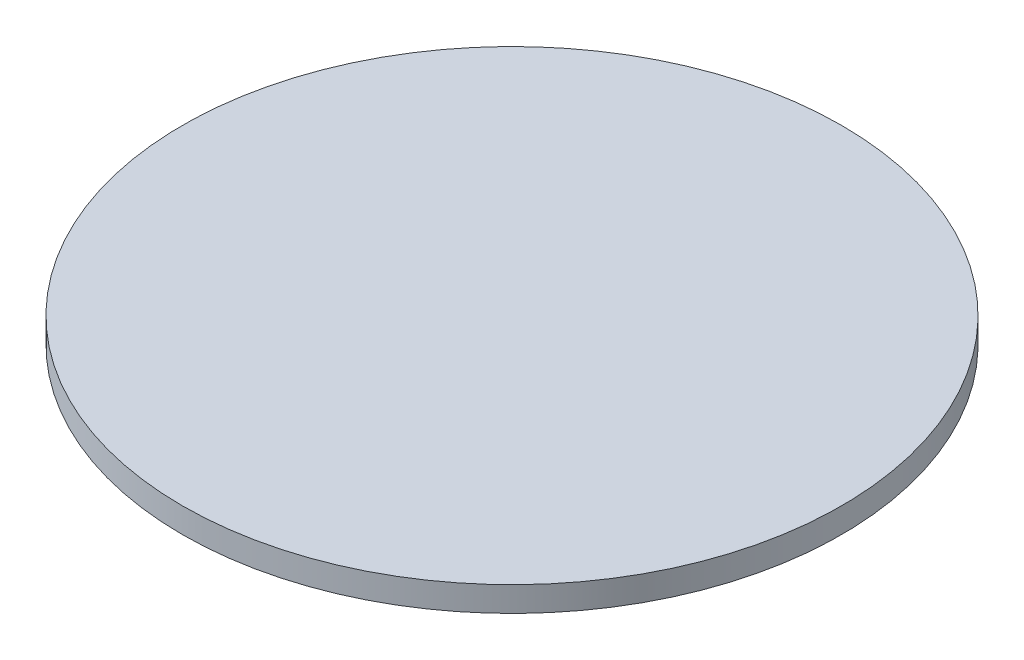
ISO-10303-21;
HEADER;
FILE_DESCRIPTION(('STEP AP214'),'2;1');
FILE_NAME('part.step','',(''),(''),'','','');
FILE_SCHEMA(('AUTOMOTIVE_DESIGN { 1 0 10303 214 1 1 1 1 }'));
ENDSEC;
DATA;
#1=APPLICATION_CONTEXT('core data for automotive mechanical design processes');
#2=APPLICATION_PROTOCOL_DEFINITION('international standard','automotive_design',2000,#1);
#3=PRODUCT_CONTEXT('',#1,'mechanical');
#4=PRODUCT('Part','Part','',(#3));
#5=PRODUCT_RELATED_PRODUCT_CATEGORY('part','',(#4));
#6=PRODUCT_DEFINITION_FORMATION('','',#4);
#7=PRODUCT_DEFINITION_CONTEXT('part definition',#1,'design');
#8=PRODUCT_DEFINITION('design','',#6,#7);
#9=PRODUCT_DEFINITION_SHAPE('','',#8);
#10=(LENGTH_UNIT() NAMED_UNIT(*) SI_UNIT(.MILLI.,.METRE.));
#11=(NAMED_UNIT(*) PLANE_ANGLE_UNIT() SI_UNIT($,.RADIAN.));
#12=(NAMED_UNIT(*) SI_UNIT($,.STERADIAN.) SOLID_ANGLE_UNIT());
#13=UNCERTAINTY_MEASURE_WITH_UNIT(LENGTH_MEASURE(1.E-05),#10,'distance_accuracy_value','');
#14=(GEOMETRIC_REPRESENTATION_CONTEXT(3) GLOBAL_UNCERTAINTY_ASSIGNED_CONTEXT((#13)) GLOBAL_UNIT_ASSIGNED_CONTEXT((#10,
#11,#12)) REPRESENTATION_CONTEXT('',''));
#15=CARTESIAN_POINT('',(0.,0.,0.));
#16=DIRECTION('',(0.,0.,1.));
#17=DIRECTION('',(1.,0.,0.));
#18=AXIS2_PLACEMENT_3D('',#15,#16,#17);
#19=CARTESIAN_POINT('',(0.,0.79375,0.));
#20=DIRECTION('',(0.,-1.,0.));
#21=DIRECTION('',(0.,0.,-1.));
#22=AXIS2_PLACEMENT_3D('',#19,#20,#21);
#23=CYLINDRICAL_SURFACE('',#22,220.29375);
#24=CARTESIAN_POINT('',(0.,-13.4658722101948,0.));
#25=DIRECTION('',(0.,-1.,0.));
#26=DIRECTION('',(0.,0.,-1.));
#27=AXIS2_PLACEMENT_3D('',#24,#25,#26);
#28=CIRCLE('',#27,220.29375);
#29=CARTESIAN_POINT('',(-220.262941421733,-13.4658722101948,3.68414512592614));
#30=VERTEX_POINT('',#29);
#31=CARTESIAN_POINT('',(-219.484918456649,-13.4658722101948,18.8601924470733));
#32=VERTEX_POINT('',#31);
#33=EDGE_CURVE('E161',#30,#32,#28,.F.);
#34=ORIENTED_EDGE('',*,*,#33,.F.);
#35=CARTESIAN_POINT('',(0.,-13.4658722101948,0.));
#36=DIRECTION('',(0.,-1.,0.));
#37=DIRECTION('',(0.,0.,-1.));
#38=AXIS2_PLACEMENT_3D('',#35,#36,#37);
#39=CIRCLE('',#38,220.29375);
#40=CARTESIAN_POINT('',(-220.128586465602,-13.4658722101948,-8.52887505585829));
#41=VERTEX_POINT('',#40);
#42=EDGE_CURVE('E63',#41,#30,#39,.F.);
#43=ORIENTED_EDGE('',*,*,#42,.F.);
#44=DIRECTION('',(0.,-1.,0.));
#45=VECTOR('',#44,1.);
#46=CARTESIAN_POINT('',(-220.128586465602,0.79375,-8.52887505585829));
#47=LINE('',#46,#45);
#48=CARTESIAN_POINT('',(-220.128586465602,0.,-8.52887505585829));
#49=VERTEX_POINT('',#48);
#50=EDGE_CURVE('E58',#49,#41,#47,.T.);
#51=ORIENTED_EDGE('',*,*,#50,.F.);
#52=CARTESIAN_POINT('',(0.,0.,0.));
#53=DIRECTION('',(0.,1.,0.));
#54=DIRECTION('',(0.,0.,1.));
#55=AXIS2_PLACEMENT_3D('',#52,#53,#54);
#56=CIRCLE('',#55,220.29375);
#57=CARTESIAN_POINT('',(-220.262941421733,0.,3.68414512592614));
#58=VERTEX_POINT('',#57);
#59=EDGE_CURVE('E157',#58,#49,#56,.F.);
#60=ORIENTED_EDGE('',*,*,#59,.F.);
#61=CARTESIAN_POINT('',(0.,0.,0.));
#62=DIRECTION('',(0.,1.,0.));
#63=DIRECTION('',(0.,0.,1.));
#64=AXIS2_PLACEMENT_3D('',#61,#62,#63);
#65=CIRCLE('',#64,220.29375);
#66=CARTESIAN_POINT('',(-219.484918456649,0.,18.8601924470733));
#67=VERTEX_POINT('',#66);
#68=EDGE_CURVE('E167',#67,#58,#65,.F.);
#69=ORIENTED_EDGE('',*,*,#68,.F.);
#70=DIRECTION('',(0.,-1.,0.));
#71=VECTOR('',#70,1.);
#72=CARTESIAN_POINT('',(-219.484918456649,0.79375,18.8601924470733));
#73=LINE('',#72,#71);
#74=EDGE_CURVE('E164',#32,#67,#73,.F.);
#75=ORIENTED_EDGE('',*,*,#74,.F.);
#76=EDGE_LOOP('',(#34,#43,#51,#60,#69,#75));
#77=FACE_BOUND('',#76,.T.);
#78=CARTESIAN_POINT('',(0.,-15.875,0.));
#79=DIRECTION('',(0.,-1.,0.));
#80=DIRECTION('',(0.,0.,-1.));
#81=AXIS2_PLACEMENT_3D('',#78,#79,#80);
#82=CIRCLE('',#81,220.29375);
#83=CARTESIAN_POINT('',(0.,-15.875,-220.29375));
#84=VERTEX_POINT('',#83);
#85=EDGE_CURVE('E51',#84,#84,#82,.T.);
#86=ORIENTED_EDGE('',*,*,#85,.F.);
#87=EDGE_LOOP('',(#86));
#88=FACE_BOUND('',#87,.T.);
#89=CARTESIAN_POINT('',(0.,0.79375,0.));
#90=DIRECTION('',(0.,1.,0.));
#91=DIRECTION('',(0.,0.,1.));
#92=AXIS2_PLACEMENT_3D('',#89,#90,#91);
#93=CIRCLE('',#92,220.29375);
#94=CARTESIAN_POINT('',(0.,0.79375,220.29375));
#95=VERTEX_POINT('',#94);
#96=EDGE_CURVE('E13',#95,#95,#93,.T.);
#97=ORIENTED_EDGE('',*,*,#96,.F.);
#98=EDGE_LOOP('',(#97));
#99=FACE_BOUND('',#98,.T.);
#100=ADVANCED_FACE('F44',(#77,#88,#99),#23,.T.);
#101=CARTESIAN_POINT('',(0.,0.,0.));
#102=DIRECTION('',(0.,1.,0.));
#103=DIRECTION('',(0.,0.,1.));
#104=AXIS2_PLACEMENT_3D('',#101,#102,#103);
#105=PLANE('',#104);
#106=CARTESIAN_POINT('',(0.,0.,0.));
#107=DIRECTION('',(0.,-1.,0.));
#108=DIRECTION('',(0.,0.,-1.));
#109=AXIS2_PLACEMENT_3D('',#106,#107,#108);
#110=CIRCLE('',#109,219.5);
#111=CARTESIAN_POINT('',(-219.132288812032,0.,-12.7));
#112=VERTEX_POINT('',#111);
#113=CARTESIAN_POINT('',(219.132288812032,0.,-12.7));
#114=VERTEX_POINT('',#113);
#115=EDGE_CURVE('E215',#112,#114,#110,.T.);
#116=ORIENTED_EDGE('',*,*,#115,.T.);
#117=DIRECTION('',(1.,0.,0.));
#118=VECTOR('',#117,1.);
#119=CARTESIAN_POINT('',(-220.29575,0.,-12.7));
#120=LINE('',#119,#118);
#121=EDGE_CURVE('E218',#112,#114,#120,.T.);
#122=ORIENTED_EDGE('',*,*,#121,.F.);
#123=EDGE_LOOP('',(#116,#122));
#124=FACE_BOUND('',#123,.T.);
#125=ADVANCED_FACE('F250',(#124),#105,.F.);
#126=CARTESIAN_POINT('',(0.,0.79375,0.));
#127=DIRECTION('',(0.,1.,0.));
#128=DIRECTION('',(0.,0.,1.));
#129=AXIS2_PLACEMENT_3D('',#126,#127,#128);
#130=PLANE('',#129);
#131=ORIENTED_EDGE('',*,*,#96,.T.);
#132=EDGE_LOOP('',(#131));
#133=FACE_BOUND('',#132,.T.);
#134=ADVANCED_FACE('F253',(#133),#130,.T.);
#135=CARTESIAN_POINT('',(0.,-15.875,0.));
#136=DIRECTION('',(0.,-1.,0.));
#137=DIRECTION('',(0.,0.,-1.));
#138=AXIS2_PLACEMENT_3D('',#135,#136,#137);
#139=PLANE('',#138);
#140=ORIENTED_EDGE('',*,*,#85,.T.);
#141=EDGE_LOOP('',(#140));
#142=FACE_BOUND('',#141,.T.);
#143=CARTESIAN_POINT('',(0.,-15.875,0.));
#144=DIRECTION('',(0.,-1.,0.));
#145=DIRECTION('',(0.,0.,-1.));
#146=AXIS2_PLACEMENT_3D('',#143,#144,#145);
#147=CIRCLE('',#146,219.5);
#148=CARTESIAN_POINT('',(0.,-15.875,-219.5));
#149=VERTEX_POINT('',#148);
#150=EDGE_CURVE('E237',#149,#149,#147,.T.);
#151=ORIENTED_EDGE('',*,*,#150,.F.);
#152=EDGE_LOOP('',(#151));
#153=FACE_BOUND('',#152,.T.);
#154=ADVANCED_FACE('F245',(#142,#153),#139,.T.);
#155=CARTESIAN_POINT('',(0.,-15.875,0.));
#156=DIRECTION('',(0.,1.,0.));
#157=DIRECTION('',(0.,0.,1.));
#158=AXIS2_PLACEMENT_3D('',#155,#156,#157);
#159=CYLINDRICAL_SURFACE('',#158,219.5);
#160=DIRECTION('',(0.,1.,0.));
#161=VECTOR('',#160,1.);
#162=CARTESIAN_POINT('',(219.132288812032,-15.875,-12.7));
#163=LINE('',#162,#161);
#164=CARTESIAN_POINT('',(219.132288812032,-2.38124999999996,-12.7));
#165=VERTEX_POINT('',#164);
#166=EDGE_CURVE('E196',#114,#165,#163,.F.);
#167=ORIENTED_EDGE('',*,*,#166,.F.);
#168=ORIENTED_EDGE('',*,*,#115,.F.);
#169=DIRECTION('',(0.,1.,0.));
#170=VECTOR('',#169,1.);
#171=CARTESIAN_POINT('',(-219.132288812032,-15.875,-12.7));
#172=LINE('',#171,#170);
#173=CARTESIAN_POINT('',(-219.132288812032,-2.38124999999996,-12.7));
#174=VERTEX_POINT('',#173);
#175=EDGE_CURVE('E220',#112,#174,#172,.F.);
#176=ORIENTED_EDGE('',*,*,#175,.T.);
#177=CARTESIAN_POINT('',(0.,-2.38124999999996,0.));
#178=DIRECTION('',(0.,-1.,0.));
#179=DIRECTION('',(0.,0.,-1.));
#180=AXIS2_PLACEMENT_3D('',#177,#178,#179);
#181=CIRCLE('',#180,219.5);
#182=CARTESIAN_POINT('',(-219.4942592501,-2.38124999999996,-1.5875));
#183=VERTEX_POINT('',#182);
#184=EDGE_CURVE('E212',#174,#183,#181,.F.);
#185=ORIENTED_EDGE('',*,*,#184,.T.);
#186=DIRECTION('',(0.,1.,0.));
#187=VECTOR('',#186,1.);
#188=CARTESIAN_POINT('',(-219.4942592501,-15.875,-1.5875));
#189=LINE('',#188,#187);
#190=CARTESIAN_POINT('',(-219.4942592501,-11.90625,-1.5875));
#191=VERTEX_POINT('',#190);
#192=EDGE_CURVE('E216',#183,#191,#189,.F.);
#193=ORIENTED_EDGE('',*,*,#192,.T.);
#194=CARTESIAN_POINT('',(0.,-11.90625,0.));
#195=DIRECTION('',(0.,-1.,0.));
#196=DIRECTION('',(0.,0.,-1.));
#197=AXIS2_PLACEMENT_3D('',#194,#195,#196);
#198=CIRCLE('',#197,219.5);
#199=CARTESIAN_POINT('',(-219.4942592501,-11.90625,1.5875));
#200=VERTEX_POINT('',#199);
#201=EDGE_CURVE('E223',#191,#200,#198,.F.);
#202=ORIENTED_EDGE('',*,*,#201,.T.);
#203=DIRECTION('',(0.,1.,0.));
#204=VECTOR('',#203,1.);
#205=CARTESIAN_POINT('',(-219.4942592501,-15.875,1.5875));
#206=LINE('',#205,#204);
#207=CARTESIAN_POINT('',(-219.4942592501,-2.38124999999996,1.5875));
#208=VERTEX_POINT('',#207);
#209=EDGE_CURVE('E226',#200,#208,#206,.T.);
#210=ORIENTED_EDGE('',*,*,#209,.T.);
#211=CARTESIAN_POINT('',(0.,-2.38124999999996,0.));
#212=DIRECTION('',(0.,-1.,0.));
#213=DIRECTION('',(0.,0.,-1.));
#214=AXIS2_PLACEMENT_3D('',#211,#212,#213);
#215=CIRCLE('',#214,219.5);
#216=CARTESIAN_POINT('',(-219.132288812032,-2.38124999999996,12.7));
#217=VERTEX_POINT('',#216);
#218=EDGE_CURVE('E229',#208,#217,#215,.F.);
#219=ORIENTED_EDGE('',*,*,#218,.T.);
#220=DIRECTION('',(0.,1.,0.));
#221=VECTOR('',#220,1.);
#222=CARTESIAN_POINT('',(-219.132288812032,-15.875,12.7));
#223=LINE('',#222,#221);
#224=CARTESIAN_POINT('',(-219.132288812032,0.,12.7));
#225=VERTEX_POINT('',#224);
#226=EDGE_CURVE('E232',#217,#225,#223,.T.);
#227=ORIENTED_EDGE('',*,*,#226,.T.);
#228=CARTESIAN_POINT('',(219.132288812032,0.,12.7));
#229=VERTEX_POINT('',#228);
#230=EDGE_CURVE('E240',#229,#225,#110,.T.);
#231=ORIENTED_EDGE('',*,*,#230,.F.);
#232=DIRECTION('',(0.,1.,0.));
#233=VECTOR('',#232,1.);
#234=CARTESIAN_POINT('',(219.132288812032,-15.875,12.7));
#235=LINE('',#234,#233);
#236=CARTESIAN_POINT('',(219.132288812032,-2.38124999999996,12.7));
#237=VERTEX_POINT('',#236);
#238=EDGE_CURVE('E194',#237,#229,#235,.T.);
#239=ORIENTED_EDGE('',*,*,#238,.F.);
#240=CARTESIAN_POINT('',(0.,-2.38124999999996,0.));
#241=DIRECTION('',(0.,1.,0.));
#242=DIRECTION('',(0.,0.,1.));
#243=AXIS2_PLACEMENT_3D('',#240,#241,#242);
#244=CIRCLE('',#243,219.5);
#245=CARTESIAN_POINT('',(219.4942592501,-2.38124999999996,1.5875));
#246=VERTEX_POINT('',#245);
#247=EDGE_CURVE('E191',#246,#237,#244,.F.);
#248=ORIENTED_EDGE('',*,*,#247,.F.);
#249=DIRECTION('',(0.,1.,0.));
#250=VECTOR('',#249,1.);
#251=CARTESIAN_POINT('',(219.4942592501,-15.875,1.5875));
#252=LINE('',#251,#250);
#253=CARTESIAN_POINT('',(219.4942592501,-11.90625,1.5875));
#254=VERTEX_POINT('',#253);
#255=EDGE_CURVE('E188',#254,#246,#252,.T.);
#256=ORIENTED_EDGE('',*,*,#255,.F.);
#257=CARTESIAN_POINT('',(0.,-11.90625,0.));
#258=DIRECTION('',(0.,1.,0.));
#259=DIRECTION('',(0.,0.,1.));
#260=AXIS2_PLACEMENT_3D('',#257,#258,#259);
#261=CIRCLE('',#260,219.5);
#262=CARTESIAN_POINT('',(219.4942592501,-11.90625,-1.5875));
#263=VERTEX_POINT('',#262);
#264=EDGE_CURVE('E185',#263,#254,#261,.F.);
#265=ORIENTED_EDGE('',*,*,#264,.F.);
#266=DIRECTION('',(0.,1.,0.));
#267=VECTOR('',#266,1.);
#268=CARTESIAN_POINT('',(219.4942592501,-15.875,-1.5875));
#269=LINE('',#268,#267);
#270=CARTESIAN_POINT('',(219.4942592501,-2.38124999999996,-1.5875));
#271=VERTEX_POINT('',#270);
#272=EDGE_CURVE('E182',#271,#263,#269,.F.);
#273=ORIENTED_EDGE('',*,*,#272,.F.);
#274=CARTESIAN_POINT('',(0.,-2.38124999999996,0.));
#275=DIRECTION('',(0.,1.,0.));
#276=DIRECTION('',(0.,0.,1.));
#277=AXIS2_PLACEMENT_3D('',#274,#275,#276);
#278=CIRCLE('',#277,219.5);
#279=EDGE_CURVE('E170',#165,#271,#278,.F.);
#280=ORIENTED_EDGE('',*,*,#279,.F.);
#281=EDGE_LOOP('',(#167,#168,#176,#185,#193,#202,#210,#219,#227,#231,#239,#248,#256,#265,#273,#280));
#282=FACE_BOUND('',#281,.T.);
#283=ORIENTED_EDGE('',*,*,#150,.T.);
#284=EDGE_LOOP('',(#283));
#285=FACE_BOUND('',#284,.T.);
#286=ADVANCED_FACE('F260',(#282,#285),#159,.F.);
#287=ORIENTED_EDGE('',*,*,#230,.T.);
#288=DIRECTION('',(-1.,0.,0.));
#289=VECTOR('',#288,1.);
#290=CARTESIAN_POINT('',(-220.29575,0.,12.7));
#291=LINE('',#290,#289);
#292=EDGE_CURVE('E211',#229,#225,#291,.T.);
#293=ORIENTED_EDGE('',*,*,#292,.F.);
#294=EDGE_LOOP('',(#287,#293));
#295=FACE_BOUND('',#294,.T.);
#296=ADVANCED_FACE('F263',(#295),#105,.F.);
#297=CARTESIAN_POINT('',(-220.29575,0.793750000000043,-12.7));
#298=DIRECTION('',(0.,0.,-1.));
#299=DIRECTION('',(-1.,0.,0.));
#300=AXIS2_PLACEMENT_3D('',#297,#298,#299);
#301=PLANE('',#300);
#302=ORIENTED_EDGE('',*,*,#175,.F.);
#303=ORIENTED_EDGE('',*,*,#121,.T.);
#304=ORIENTED_EDGE('',*,*,#166,.T.);
#305=DIRECTION('',(1.,0.,0.));
#306=VECTOR('',#305,1.);
#307=CARTESIAN_POINT('',(-220.29575,-2.38124999999996,-12.7));
#308=LINE('',#307,#306);
#309=EDGE_CURVE('E199',#174,#165,#308,.T.);
#310=ORIENTED_EDGE('',*,*,#309,.F.);
#311=EDGE_LOOP('',(#302,#303,#304,#310));
#312=FACE_BOUND('',#311,.T.);
#313=ADVANCED_FACE('F266',(#312),#301,.T.);
#314=CARTESIAN_POINT('',(-220.29575,-2.38124999999996,-12.7));
#315=DIRECTION('',(0.,-1.,0.));
#316=DIRECTION('',(0.,0.,-1.));
#317=AXIS2_PLACEMENT_3D('',#314,#315,#316);
#318=PLANE('',#317);
#319=ORIENTED_EDGE('',*,*,#184,.F.);
#320=ORIENTED_EDGE('',*,*,#309,.T.);
#321=ORIENTED_EDGE('',*,*,#279,.T.);
#322=DIRECTION('',(1.,0.,0.));
#323=VECTOR('',#322,1.);
#324=CARTESIAN_POINT('',(-220.29575,-2.38124999999996,-1.5875));
#325=LINE('',#324,#323);
#326=EDGE_CURVE('E201',#183,#271,#325,.T.);
#327=ORIENTED_EDGE('',*,*,#326,.F.);
#328=EDGE_LOOP('',(#319,#320,#321,#327));
#329=FACE_BOUND('',#328,.T.);
#330=ADVANCED_FACE('F273',(#329),#318,.T.);
#331=CARTESIAN_POINT('',(-220.29575,-2.38124999999996,-1.5875));
#332=DIRECTION('',(0.,0.,-1.));
#333=DIRECTION('',(0.,1.,0.));
#334=AXIS2_PLACEMENT_3D('',#331,#332,#333);
#335=PLANE('',#334);
#336=ORIENTED_EDGE('',*,*,#192,.F.);
#337=ORIENTED_EDGE('',*,*,#326,.T.);
#338=ORIENTED_EDGE('',*,*,#272,.T.);
#339=DIRECTION('',(1.,0.,0.));
#340=VECTOR('',#339,1.);
#341=CARTESIAN_POINT('',(-220.29575,-11.90625,-1.5875));
#342=LINE('',#341,#340);
#343=EDGE_CURVE('E203',#191,#263,#342,.T.);
#344=ORIENTED_EDGE('',*,*,#343,.F.);
#345=EDGE_LOOP('',(#336,#337,#338,#344));
#346=FACE_BOUND('',#345,.T.);
#347=ADVANCED_FACE('F300',(#346),#335,.T.);
#348=CARTESIAN_POINT('',(-220.29575,-11.90625,-1.5875));
#349=DIRECTION('',(0.,-1.,0.));
#350=DIRECTION('',(0.,0.,-1.));
#351=AXIS2_PLACEMENT_3D('',#348,#349,#350);
#352=PLANE('',#351);
#353=ORIENTED_EDGE('',*,*,#201,.F.);
#354=ORIENTED_EDGE('',*,*,#343,.T.);
#355=ORIENTED_EDGE('',*,*,#264,.T.);
#356=DIRECTION('',(1.,0.,0.));
#357=VECTOR('',#356,1.);
#358=CARTESIAN_POINT('',(-220.29575,-11.90625,1.5875));
#359=LINE('',#358,#357);
#360=EDGE_CURVE('E205',#200,#254,#359,.T.);
#361=ORIENTED_EDGE('',*,*,#360,.F.);
#362=EDGE_LOOP('',(#353,#354,#355,#361));
#363=FACE_BOUND('',#362,.T.);
#364=ADVANCED_FACE('F296',(#363),#352,.T.);
#365=CARTESIAN_POINT('',(-220.29575,-2.38124999999996,1.5875));
#366=DIRECTION('',(0.,0.,1.));
#367=DIRECTION('',(0.,-1.,0.));
#368=AXIS2_PLACEMENT_3D('',#365,#366,#367);
#369=PLANE('',#368);
#370=ORIENTED_EDGE('',*,*,#209,.F.);
#371=ORIENTED_EDGE('',*,*,#360,.T.);
#372=ORIENTED_EDGE('',*,*,#255,.T.);
#373=DIRECTION('',(1.,0.,0.));
#374=VECTOR('',#373,1.);
#375=CARTESIAN_POINT('',(-220.29575,-2.38124999999996,1.5875));
#376=LINE('',#375,#374);
#377=EDGE_CURVE('E207',#208,#246,#376,.T.);
#378=ORIENTED_EDGE('',*,*,#377,.F.);
#379=EDGE_LOOP('',(#370,#371,#372,#378));
#380=FACE_BOUND('',#379,.T.);
#381=ADVANCED_FACE('F288',(#380),#369,.T.);
#382=CARTESIAN_POINT('',(-220.29575,-2.38124999999996,12.7));
#383=DIRECTION('',(0.,-1.,0.));
#384=DIRECTION('',(0.,0.,-1.));
#385=AXIS2_PLACEMENT_3D('',#382,#383,#384);
#386=PLANE('',#385);
#387=ORIENTED_EDGE('',*,*,#218,.F.);
#388=ORIENTED_EDGE('',*,*,#377,.T.);
#389=ORIENTED_EDGE('',*,*,#247,.T.);
#390=DIRECTION('',(1.,0.,0.));
#391=VECTOR('',#390,1.);
#392=CARTESIAN_POINT('',(-220.29575,-2.38124999999996,12.7));
#393=LINE('',#392,#391);
#394=EDGE_CURVE('E209',#217,#237,#393,.T.);
#395=ORIENTED_EDGE('',*,*,#394,.F.);
#396=EDGE_LOOP('',(#387,#388,#389,#395));
#397=FACE_BOUND('',#396,.T.);
#398=ADVANCED_FACE('F279',(#397),#386,.T.);
#399=CARTESIAN_POINT('',(-220.29575,0.793750000000043,12.7));
#400=DIRECTION('',(0.,0.,1.));
#401=DIRECTION('',(1.,0.,0.));
#402=AXIS2_PLACEMENT_3D('',#399,#400,#401);
#403=PLANE('',#402);
#404=ORIENTED_EDGE('',*,*,#394,.T.);
#405=ORIENTED_EDGE('',*,*,#238,.T.);
#406=ORIENTED_EDGE('',*,*,#292,.T.);
#407=ORIENTED_EDGE('',*,*,#226,.F.);
#408=EDGE_LOOP('',(#404,#405,#406,#407));
#409=FACE_BOUND('',#408,.T.);
#410=ADVANCED_FACE('F268',(#409),#403,.T.);
#411=CARTESIAN_POINT('',(-220.262941421733,0.,3.68414512592614));
#412=DIRECTION('',(-0.999860147742424,0.,0.0167237841560468));
#413=DIRECTION('',(0.0167237841560468,0.,0.999860147742424));
#414=AXIS2_PLACEMENT_3D('',#411,#412,#413);
#415=PLANE('',#414);
#416=DIRECTION('',(-0.0167237841560468,0.,-0.999860147742424));
#417=VECTOR('',#416,1.);
#418=CARTESIAN_POINT('',(-220.467123193554,0.,-8.52321264879071));
#419=LINE('',#418,#417);
#420=CARTESIAN_POINT('',(-220.008958375307,0.,18.868957603389));
#421=VERTEX_POINT('',#420);
#422=EDGE_CURVE('E175',#421,#58,#419,.T.);
#423=ORIENTED_EDGE('',*,*,#422,.T.);
#424=DIRECTION('',(-0.0167237841560468,0.,-0.999860147742424));
#425=VECTOR('',#424,1.);
#426=CARTESIAN_POINT('',(-220.467123193554,0.,-8.52321264879071));
#427=LINE('',#426,#425);
#428=CARTESIAN_POINT('',(-220.467123193554,0.,-8.52321264879071));
#429=VERTEX_POINT('',#428);
#430=EDGE_CURVE('E151',#58,#429,#427,.T.);
#431=ORIENTED_EDGE('',*,*,#430,.T.);
#432=DIRECTION('',(0.,-1.,0.));
#433=VECTOR('',#432,1.);
#434=CARTESIAN_POINT('',(-220.467123193554,0.,-8.52321264879071));
#435=LINE('',#434,#433);
#436=CARTESIAN_POINT('',(-220.467123193554,-13.4658722101948,-8.52321264879071));
#437=VERTEX_POINT('',#436);
#438=EDGE_CURVE('E142',#429,#437,#435,.T.);
#439=ORIENTED_EDGE('',*,*,#438,.T.);
#440=DIRECTION('',(0.0167237841560468,0.,0.999860147742424));
#441=VECTOR('',#440,1.);
#442=CARTESIAN_POINT('',(-220.467123193554,-13.4658722101948,-8.52321264879071));
#443=LINE('',#442,#441);
#444=EDGE_CURVE('E147',#437,#30,#443,.T.);
#445=ORIENTED_EDGE('',*,*,#444,.T.);
#446=DIRECTION('',(0.0167237841560468,0.,0.999860147742424));
#447=VECTOR('',#446,1.);
#448=CARTESIAN_POINT('',(-220.467123193554,-13.4658722101948,-8.52321264879071));
#449=LINE('',#448,#447);
#450=CARTESIAN_POINT('',(-220.008958375307,-13.4658722101948,18.868957603389));
#451=VERTEX_POINT('',#450);
#452=EDGE_CURVE('E144',#30,#451,#449,.T.);
#453=ORIENTED_EDGE('',*,*,#452,.T.);
#454=DIRECTION('',(0.,1.,0.));
#455=VECTOR('',#454,1.);
#456=CARTESIAN_POINT('',(-220.008958375307,0.,18.868957603389));
#457=LINE('',#456,#455);
#458=EDGE_CURVE('E172',#451,#421,#457,.T.);
#459=ORIENTED_EDGE('',*,*,#458,.T.);
#460=EDGE_LOOP('',(#423,#431,#439,#445,#453,#459));
#461=FACE_BOUND('',#460,.T.);
#462=ADVANCED_FACE('F154',(#461),#415,.T.);
#463=CARTESIAN_POINT('',(223.712601711966,-13.4658722101948,-15.9526175136456));
#464=DIRECTION('',(0.,-1.,0.));
#465=DIRECTION('',(0.,0.,-1.));
#466=AXIS2_PLACEMENT_3D('',#463,#464,#465);
#467=PLANE('',#466);
#468=ORIENTED_EDGE('',*,*,#452,.F.);
#469=ORIENTED_EDGE('',*,*,#33,.T.);
#470=DIRECTION('',(-0.999860147742424,0.,0.0167237841560466));
#471=VECTOR('',#470,1.);
#472=CARTESIAN_POINT('',(224.170766530213,-13.4658722101948,11.4395527385341));
#473=LINE('',#472,#471);
#474=EDGE_CURVE('E177',#32,#451,#473,.T.);
#475=ORIENTED_EDGE('',*,*,#474,.T.);
#476=EDGE_LOOP('',(#468,#469,#475));
#477=FACE_BOUND('',#476,.T.);
#478=ADVANCED_FACE('F286',(#477),#467,.T.);
#479=CARTESIAN_POINT('',(224.170766530213,0.,11.4395527385341));
#480=DIRECTION('',(0.0167237841560466,0.,0.999860147742424));
#481=DIRECTION('',(0.999860147742424,0.,-0.0167237841560466));
#482=AXIS2_PLACEMENT_3D('',#479,#480,#481);
#483=PLANE('',#482);
#484=ORIENTED_EDGE('',*,*,#474,.F.);
#485=ORIENTED_EDGE('',*,*,#74,.T.);
#486=DIRECTION('',(-0.999860147742424,0.,0.0167237841560466));
#487=VECTOR('',#486,1.);
#488=CARTESIAN_POINT('',(224.170766530213,0.,11.4395527385341));
#489=LINE('',#488,#487);
#490=EDGE_CURVE('E165',#67,#421,#489,.T.);
#491=ORIENTED_EDGE('',*,*,#490,.T.);
#492=ORIENTED_EDGE('',*,*,#458,.F.);
#493=EDGE_LOOP('',(#484,#485,#491,#492));
#494=FACE_BOUND('',#493,.T.);
#495=ADVANCED_FACE('F373',(#494),#483,.T.);
#496=CARTESIAN_POINT('',(223.712601711966,0.,-15.9526175136456));
#497=DIRECTION('',(0.,1.,0.));
#498=DIRECTION('',(0.,0.,1.));
#499=AXIS2_PLACEMENT_3D('',#496,#497,#498);
#500=PLANE('',#499);
#501=ORIENTED_EDGE('',*,*,#490,.F.);
#502=ORIENTED_EDGE('',*,*,#68,.T.);
#503=ORIENTED_EDGE('',*,*,#422,.F.);
#504=EDGE_LOOP('',(#501,#502,#503));
#505=FACE_BOUND('',#504,.T.);
#506=ADVANCED_FACE('F382',(#505),#500,.T.);
#507=CARTESIAN_POINT('',(223.712601711966,-13.4658722101948,-15.9526175136456));
#508=DIRECTION('',(0.,-1.,0.));
#509=DIRECTION('',(0.,0.,-1.));
#510=AXIS2_PLACEMENT_3D('',#507,#508,#509);
#511=PLANE('',#510);
#512=DIRECTION('',(-0.999860147742424,0.,0.0167237841560466));
#513=VECTOR('',#512,1.);
#514=CARTESIAN_POINT('',(223.712601711966,-13.4658722101948,-15.9526175136456));
#515=LINE('',#514,#513);
#516=EDGE_CURVE('E138',#41,#437,#515,.T.);
#517=ORIENTED_EDGE('',*,*,#516,.F.);
#518=ORIENTED_EDGE('',*,*,#42,.T.);
#519=ORIENTED_EDGE('',*,*,#444,.F.);
#520=EDGE_LOOP('',(#517,#518,#519));
#521=FACE_BOUND('',#520,.T.);
#522=ADVANCED_FACE('F148',(#521),#511,.T.);
#523=CARTESIAN_POINT('',(223.712601711966,0.,-15.9526175136456));
#524=DIRECTION('',(0.,1.,0.));
#525=DIRECTION('',(0.,0.,1.));
#526=AXIS2_PLACEMENT_3D('',#523,#524,#525);
#527=PLANE('',#526);
#528=ORIENTED_EDGE('',*,*,#430,.F.);
#529=ORIENTED_EDGE('',*,*,#59,.T.);
#530=DIRECTION('',(-0.999860147742424,0.,0.0167237841560466));
#531=VECTOR('',#530,1.);
#532=CARTESIAN_POINT('',(223.712601711966,0.,-15.9526175136456));
#533=LINE('',#532,#531);
#534=EDGE_CURVE('E422',#49,#429,#533,.T.);
#535=ORIENTED_EDGE('',*,*,#534,.T.);
#536=EDGE_LOOP('',(#528,#529,#535));
#537=FACE_BOUND('',#536,.T.);
#538=ADVANCED_FACE('F400',(#537),#527,.T.);
#539=CARTESIAN_POINT('',(223.712601711966,0.,-15.9526175136456));
#540=DIRECTION('',(-0.0167237841560466,0.,-0.999860147742424));
#541=DIRECTION('',(-0.999860147742424,0.,0.0167237841560466));
#542=AXIS2_PLACEMENT_3D('',#539,#540,#541);
#543=PLANE('',#542);
#544=ORIENTED_EDGE('',*,*,#534,.F.);
#545=ORIENTED_EDGE('',*,*,#50,.T.);
#546=ORIENTED_EDGE('',*,*,#516,.T.);
#547=ORIENTED_EDGE('',*,*,#438,.F.);
#548=EDGE_LOOP('',(#544,#545,#546,#547));
#549=FACE_BOUND('',#548,.T.);
#550=ADVANCED_FACE('F140',(#549),#543,.T.);
#551=CLOSED_SHELL('',(#100,#125,#134,#154,#286,#296,#313,#330,#347,#364,#381,#398,#410,#462,
#478,#495,#506,#522,#538,#550));
#552=MANIFOLD_SOLID_BREP('B2',#551);
#553=ADVANCED_BREP_SHAPE_REPRESENTATION('',(#18,#552),#14);
#554=SHAPE_DEFINITION_REPRESENTATION(#9,#553);
ENDSEC;
END-ISO-10303-21;
